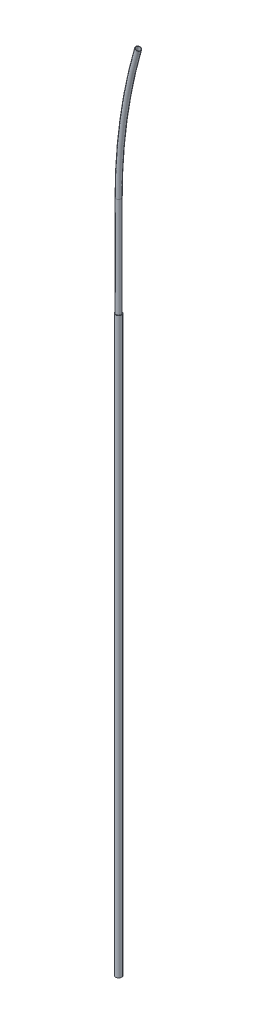
ISO-10303-21;
HEADER;
FILE_DESCRIPTION(('STEP AP214'),'2;1');
FILE_NAME('part.step','',(''),(''),'','','');
FILE_SCHEMA(('AUTOMOTIVE_DESIGN { 1 0 10303 214 1 1 1 1 }'));
ENDSEC;
DATA;
#1=APPLICATION_CONTEXT('core data for automotive mechanical design processes');
#2=APPLICATION_PROTOCOL_DEFINITION('international standard','automotive_design',2000,#1);
#3=PRODUCT_CONTEXT('',#1,'mechanical');
#4=PRODUCT('Part','Part','',(#3));
#5=PRODUCT_RELATED_PRODUCT_CATEGORY('part','',(#4));
#6=PRODUCT_DEFINITION_FORMATION('','',#4);
#7=PRODUCT_DEFINITION_CONTEXT('part definition',#1,'design');
#8=PRODUCT_DEFINITION('design','',#6,#7);
#9=PRODUCT_DEFINITION_SHAPE('','',#8);
#10=(LENGTH_UNIT() NAMED_UNIT(*) SI_UNIT(.MILLI.,.METRE.));
#11=(NAMED_UNIT(*) PLANE_ANGLE_UNIT() SI_UNIT($,.RADIAN.));
#12=(NAMED_UNIT(*) SI_UNIT($,.STERADIAN.) SOLID_ANGLE_UNIT());
#13=UNCERTAINTY_MEASURE_WITH_UNIT(LENGTH_MEASURE(1.E-05),#10,'distance_accuracy_value','');
#14=(GEOMETRIC_REPRESENTATION_CONTEXT(3) GLOBAL_UNCERTAINTY_ASSIGNED_CONTEXT((#13)) GLOBAL_UNIT_ASSIGNED_CONTEXT((#10,
#11,#12)) REPRESENTATION_CONTEXT('',''));
#15=CARTESIAN_POINT('',(0.,0.,0.));
#16=DIRECTION('',(0.,0.,1.));
#17=DIRECTION('',(1.,0.,0.));
#18=AXIS2_PLACEMENT_3D('',#15,#16,#17);
#19=CARTESIAN_POINT('',(0.,-276.,0.));
#20=DIRECTION('',(0.,-1.,0.));
#21=DIRECTION('',(0.,0.,-1.));
#22=AXIS2_PLACEMENT_3D('',#19,#20,#21);
#23=PLANE('',#22);
#24=CARTESIAN_POINT('',(0.,-276.,0.));
#25=DIRECTION('',(0.,-1.,0.));
#26=DIRECTION('',(0.,0.,-1.));
#27=AXIS2_PLACEMENT_3D('',#24,#25,#26);
#28=CIRCLE('',#27,1.524);
#29=CARTESIAN_POINT('',(0.,-276.,-1.524));
#30=VERTEX_POINT('',#29);
#31=EDGE_CURVE('E11',#30,#30,#28,.T.);
#32=ORIENTED_EDGE('',*,*,#31,.T.);
#33=EDGE_LOOP('',(#32));
#34=FACE_BOUND('',#33,.T.);
#35=CARTESIAN_POINT('',(0.,-276.,0.));
#36=DIRECTION('',(0.,-1.,0.));
#37=DIRECTION('',(0.,0.,-1.));
#38=AXIS2_PLACEMENT_3D('',#35,#36,#37);
#39=CIRCLE('',#38,1.27);
#40=CARTESIAN_POINT('',(0.,-276.,-1.27));
#41=VERTEX_POINT('',#40);
#42=EDGE_CURVE('E64',#41,#41,#39,.T.);
#43=ORIENTED_EDGE('',*,*,#42,.F.);
#44=EDGE_LOOP('',(#43));
#45=FACE_BOUND('',#44,.T.);
#46=ADVANCED_FACE('F51',(#34,#45),#23,.T.);
#47=CARTESIAN_POINT('',(0.,10.,0.));
#48=DIRECTION('',(0.,-1.,0.));
#49=DIRECTION('',(0.,0.,-1.));
#50=AXIS2_PLACEMENT_3D('',#47,#48,#49);
#51=PLANE('',#50);
#52=CARTESIAN_POINT('',(0.,10.,0.));
#53=DIRECTION('',(0.,-1.,0.));
#54=DIRECTION('',(0.,0.,-1.));
#55=AXIS2_PLACEMENT_3D('',#52,#53,#54);
#56=CIRCLE('',#55,1.524);
#57=CARTESIAN_POINT('',(0.,10.,-1.524));
#58=VERTEX_POINT('',#57);
#59=EDGE_CURVE('E55',#58,#58,#56,.T.);
#60=ORIENTED_EDGE('',*,*,#59,.F.);
#61=EDGE_LOOP('',(#60));
#62=FACE_BOUND('',#61,.T.);
#63=CARTESIAN_POINT('',(0.,10.,0.));
#64=DIRECTION('',(0.,-1.,0.));
#65=DIRECTION('',(0.,0.,-1.));
#66=AXIS2_PLACEMENT_3D('',#63,#64,#65);
#67=CIRCLE('',#66,1.27);
#68=CARTESIAN_POINT('',(0.,10.,-1.27));
#69=VERTEX_POINT('',#68);
#70=EDGE_CURVE('E66',#69,#69,#67,.T.);
#71=ORIENTED_EDGE('',*,*,#70,.T.);
#72=EDGE_LOOP('',(#71));
#73=FACE_BOUND('',#72,.T.);
#74=ADVANCED_FACE('F78',(#62,#73),#51,.F.);
#75=CARTESIAN_POINT('',(0.,-276.,0.));
#76=DIRECTION('',(0.,1.,0.));
#77=DIRECTION('',(0.,0.,1.));
#78=AXIS2_PLACEMENT_3D('',#75,#76,#77);
#79=CYLINDRICAL_SURFACE('',#78,1.524);
#80=ORIENTED_EDGE('',*,*,#31,.F.);
#81=EDGE_LOOP('',(#80));
#82=FACE_BOUND('',#81,.T.);
#83=ORIENTED_EDGE('',*,*,#59,.T.);
#84=EDGE_LOOP('',(#83));
#85=FACE_BOUND('',#84,.T.);
#86=ADVANCED_FACE('F53',(#82,#85),#79,.T.);
#87=CARTESIAN_POINT('',(0.,-276.,0.));
#88=DIRECTION('',(0.,1.,0.));
#89=DIRECTION('',(0.,0.,1.));
#90=AXIS2_PLACEMENT_3D('',#87,#88,#89);
#91=CYLINDRICAL_SURFACE('',#90,1.27);
#92=ORIENTED_EDGE('',*,*,#42,.T.);
#93=EDGE_LOOP('',(#92));
#94=FACE_BOUND('',#93,.T.);
#95=ORIENTED_EDGE('',*,*,#70,.F.);
#96=EDGE_LOOP('',(#95));
#97=FACE_BOUND('',#96,.T.);
#98=ADVANCED_FACE('F74',(#94,#97),#91,.F.);
#99=CLOSED_SHELL('',(#46,#74,#86,#98));
#100=MANIFOLD_SOLID_BREP('B2',#99);
#101=CARTESIAN_POINT('',(0.,0.,0.));
#102=DIRECTION('',(0.,1.,0.));
#103=DIRECTION('',(0.,0.,1.));
#104=AXIS2_PLACEMENT_3D('',#101,#102,#103);
#105=PLANE('',#104);
#106=CARTESIAN_POINT('',(0.,0.,0.));
#107=DIRECTION('',(0.,1.,0.));
#108=DIRECTION('',(0.,0.,1.));
#109=AXIS2_PLACEMENT_3D('',#106,#107,#108);
#110=CIRCLE('',#109,1.265);
#111=CARTESIAN_POINT('',(0.,0.,1.265));
#112=VERTEX_POINT('',#111);
#113=EDGE_CURVE('E121',#112,#112,#110,.T.);
#114=ORIENTED_EDGE('',*,*,#113,.F.);
#115=EDGE_LOOP('',(#114));
#116=FACE_BOUND('',#115,.T.);
#117=CARTESIAN_POINT('',(0.,0.,0.));
#118=DIRECTION('',(0.,1.,0.));
#119=DIRECTION('',(0.,0.,1.));
#120=AXIS2_PLACEMENT_3D('',#117,#118,#119);
#121=CIRCLE('',#120,1.105);
#122=CARTESIAN_POINT('',(0.,0.,1.105));
#123=VERTEX_POINT('',#122);
#124=EDGE_CURVE('E128',#123,#123,#121,.T.);
#125=ORIENTED_EDGE('',*,*,#124,.T.);
#126=EDGE_LOOP('',(#125));
#127=FACE_BOUND('',#126,.T.);
#128=ADVANCED_FACE('F117',(#116,#127),#105,.F.);
#129=CARTESIAN_POINT('',(0.,60.,0.));
#130=DIRECTION('',(0.,-1.,0.));
#131=DIRECTION('',(0.,0.,-1.));
#132=AXIS2_PLACEMENT_3D('',#129,#130,#131);
#133=CYLINDRICAL_SURFACE('',#132,1.265);
#134=CARTESIAN_POINT('',(0.,60.,0.));
#135=DIRECTION('',(0.,1.,0.));
#136=DIRECTION('',(0.,0.,1.));
#137=AXIS2_PLACEMENT_3D('',#134,#135,#136);
#138=CIRCLE('',#137,1.265);
#139=CARTESIAN_POINT('',(-1.26500000000002,60.,0.));
#140=VERTEX_POINT('',#139);
#141=EDGE_CURVE('E50',#140,#140,#138,.T.);
#142=ORIENTED_EDGE('',*,*,#141,.F.);
#143=EDGE_LOOP('',(#142));
#144=FACE_BOUND('',#143,.T.);
#145=ORIENTED_EDGE('',*,*,#113,.T.);
#146=EDGE_LOOP('',(#145));
#147=FACE_BOUND('',#146,.T.);
#148=ADVANCED_FACE('F119',(#144,#147),#133,.T.);
#149=CARTESIAN_POINT('',(0.,60.,0.));
#150=DIRECTION('',(0.,-1.,0.));
#151=DIRECTION('',(0.,0.,-1.));
#152=AXIS2_PLACEMENT_3D('',#149,#150,#151);
#153=CYLINDRICAL_SURFACE('',#152,1.105);
#154=CARTESIAN_POINT('',(0.,60.,0.));
#155=DIRECTION('',(0.,1.,0.));
#156=DIRECTION('',(0.,0.,1.));
#157=AXIS2_PLACEMENT_3D('',#154,#155,#156);
#158=CIRCLE('',#157,1.105);
#159=CARTESIAN_POINT('',(-1.10500000000002,60.,0.));
#160=VERTEX_POINT('',#159);
#161=EDGE_CURVE('E136',#160,#160,#158,.F.);
#162=ORIENTED_EDGE('',*,*,#161,.F.);
#163=EDGE_LOOP('',(#162));
#164=FACE_BOUND('',#163,.T.);
#165=ORIENTED_EDGE('',*,*,#124,.F.);
#166=EDGE_LOOP('',(#165));
#167=FACE_BOUND('',#166,.T.);
#168=ADVANCED_FACE('F144',(#164,#167),#153,.F.);
#169=CARTESIAN_POINT('',(250.,60.0000000000001,0.));
#170=DIRECTION('',(0.,0.,-1.));
#171=DIRECTION('',(-1.,0.,0.));
#172=AXIS2_PLACEMENT_3D('',#169,#170,#171);
#173=TOROIDAL_SURFACE('',#172,250.,1.265);
#174=CARTESIAN_POINT('',(9.7361404223072,129.088912141028,0.));
#175=DIRECTION('',(0.276355648564113,0.961055438310771,0.));
#176=DIRECTION('',(0.,0.,1.));
#177=AXIS2_PLACEMENT_3D('',#174,#175,#176);
#178=CIRCLE('',#177,1.265);
#179=CARTESIAN_POINT('',(8.52040529284406,129.438502036462,0.));
#180=VERTEX_POINT('',#179);
#181=EDGE_CURVE('E133',#180,#180,#178,.T.);
#182=CARTESIAN_POINT('',(250.,60.0000000000001,0.));
#183=DIRECTION('',(0.,0.,-1.));
#184=DIRECTION('',(-1.,0.,0.));
#185=AXIS2_PLACEMENT_3D('',#182,#183,#184);
#186=CIRCLE('',#185,251.265);
#187=EDGE_CURVE('',#140,#180,#186,.T.);
#188=ORIENTED_EDGE('',*,*,#141,.T.);
#189=ORIENTED_EDGE('',*,*,#181,.F.);
#190=ORIENTED_EDGE('',*,*,#187,.T.);
#191=ORIENTED_EDGE('',*,*,#187,.F.);
#192=EDGE_LOOP('',(#188,#190,#189,#191));
#193=FACE_BOUND('',#192,.T.);
#194=ADVANCED_FACE('F147',(#193),#173,.T.);
#195=CARTESIAN_POINT('',(9.7361404223072,129.088912141028,0.));
#196=DIRECTION('',(0.276355648564113,0.961055438310771,0.));
#197=DIRECTION('',(0.,0.,1.));
#198=AXIS2_PLACEMENT_3D('',#195,#196,#197);
#199=PLANE('',#198);
#200=CARTESIAN_POINT('',(9.7361404223072,129.088912141028,0.));
#201=DIRECTION('',(0.276355648564113,0.961055438310771,0.));
#202=DIRECTION('',(0.,0.,1.));
#203=AXIS2_PLACEMENT_3D('',#200,#201,#202);
#204=CIRCLE('',#203,1.105);
#205=CARTESIAN_POINT('',(8.67417416297378,129.394285132692,0.));
#206=VERTEX_POINT('',#205);
#207=EDGE_CURVE('E132',#206,#206,#204,.F.);
#208=ORIENTED_EDGE('',*,*,#207,.T.);
#209=EDGE_LOOP('',(#208));
#210=FACE_BOUND('',#209,.T.);
#211=ORIENTED_EDGE('',*,*,#181,.T.);
#212=EDGE_LOOP('',(#211));
#213=FACE_BOUND('',#212,.T.);
#214=ADVANCED_FACE('F161',(#210,#213),#199,.T.);
#215=CARTESIAN_POINT('',(250.,60.0000000000001,0.));
#216=DIRECTION('',(0.,0.,-1.));
#217=DIRECTION('',(-1.,0.,0.));
#218=AXIS2_PLACEMENT_3D('',#215,#216,#217);
#219=TOROIDAL_SURFACE('',#218,250.,1.105);
#220=CARTESIAN_POINT('',(250.,60.0000000000001,0.));
#221=DIRECTION('',(0.,0.,-1.));
#222=DIRECTION('',(-1.,0.,0.));
#223=AXIS2_PLACEMENT_3D('',#220,#221,#222);
#224=CIRCLE('',#223,251.105);
#225=EDGE_CURVE('',#160,#206,#224,.T.);
#226=ORIENTED_EDGE('',*,*,#161,.T.);
#227=ORIENTED_EDGE('',*,*,#207,.F.);
#228=ORIENTED_EDGE('',*,*,#225,.T.);
#229=ORIENTED_EDGE('',*,*,#225,.F.);
#230=EDGE_LOOP('',(#226,#228,#227,#229));
#231=FACE_BOUND('',#230,.T.);
#232=ADVANCED_FACE('F142',(#231),#219,.F.);
#233=CLOSED_SHELL('',(#128,#148,#168,#194,#214,#232));
#234=MANIFOLD_SOLID_BREP('B6',#233);
#235=ADVANCED_BREP_SHAPE_REPRESENTATION('',(#18,#100,#234),#14);
#236=SHAPE_DEFINITION_REPRESENTATION(#9,#235);
ENDSEC;
END-ISO-10303-21;
